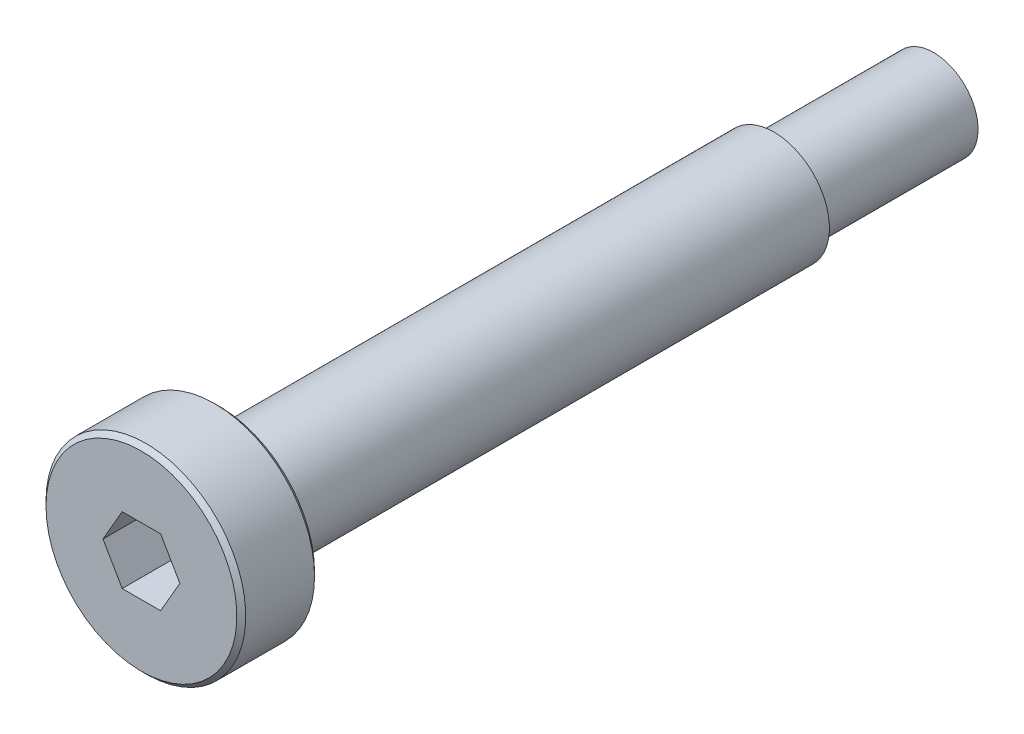
ISO-10303-21;
HEADER;
FILE_DESCRIPTION(('STEP AP214'),'2;1');
FILE_NAME('part.step','',(''),(''),'','','');
FILE_SCHEMA(('AUTOMOTIVE_DESIGN { 1 0 10303 214 1 1 1 1 }'));
ENDSEC;
DATA;
#1=APPLICATION_CONTEXT('core data for automotive mechanical design processes');
#2=APPLICATION_PROTOCOL_DEFINITION('international standard','automotive_design',2000,#1);
#3=PRODUCT_CONTEXT('',#1,'mechanical');
#4=PRODUCT('Part','Part','',(#3));
#5=PRODUCT_RELATED_PRODUCT_CATEGORY('part','',(#4));
#6=PRODUCT_DEFINITION_FORMATION('','',#4);
#7=PRODUCT_DEFINITION_CONTEXT('part definition',#1,'design');
#8=PRODUCT_DEFINITION('design','',#6,#7);
#9=PRODUCT_DEFINITION_SHAPE('','',#8);
#10=(LENGTH_UNIT() NAMED_UNIT(*) SI_UNIT(.MILLI.,.METRE.));
#11=(NAMED_UNIT(*) PLANE_ANGLE_UNIT() SI_UNIT($,.RADIAN.));
#12=(NAMED_UNIT(*) SI_UNIT($,.STERADIAN.) SOLID_ANGLE_UNIT());
#13=UNCERTAINTY_MEASURE_WITH_UNIT(LENGTH_MEASURE(1.E-05),#10,'distance_accuracy_value','');
#14=(GEOMETRIC_REPRESENTATION_CONTEXT(3) GLOBAL_UNCERTAINTY_ASSIGNED_CONTEXT((#13)) GLOBAL_UNIT_ASSIGNED_CONTEXT((#10,
#11,#12)) REPRESENTATION_CONTEXT('',''));
#15=CARTESIAN_POINT('',(0.,0.,0.));
#16=DIRECTION('',(0.,0.,1.));
#17=DIRECTION('',(1.,0.,0.));
#18=AXIS2_PLACEMENT_3D('',#15,#16,#17);
#19=CARTESIAN_POINT('',(0.,0.,0.));
#20=DIRECTION('',(0.,0.,-1.));
#21=DIRECTION('',(-1.,0.,0.));
#22=AXIS2_PLACEMENT_3D('',#19,#20,#21);
#23=PLANE('',#22);
#24=CARTESIAN_POINT('',(0.,0.,0.));
#25=DIRECTION('',(0.,0.,-1.));
#26=DIRECTION('',(-1.,0.,0.));
#27=AXIS2_PLACEMENT_3D('',#24,#25,#26);
#28=CIRCLE('',#27,4.29999999999999);
#29=CARTESIAN_POINT('',(-4.29999999999999,0.,0.));
#30=VERTEX_POINT('',#29);
#31=EDGE_CURVE('E11',#30,#30,#28,.F.);
#32=ORIENTED_EDGE('',*,*,#31,.T.);
#33=EDGE_LOOP('',(#32));
#34=FACE_BOUND('',#33,.T.);
#35=DIRECTION('',(-0.5,0.866025403784438,0.));
#36=VECTOR('',#35,1.);
#37=CARTESIAN_POINT('',(1.73205080756888,0.,0.));
#38=LINE('',#37,#36);
#39=CARTESIAN_POINT('',(1.73205080756888,0.,0.));
#40=VERTEX_POINT('',#39);
#41=CARTESIAN_POINT('',(0.866025403784438,1.5,0.));
#42=VERTEX_POINT('',#41);
#43=EDGE_CURVE('E135',#40,#42,#38,.T.);
#44=ORIENTED_EDGE('',*,*,#43,.F.);
#45=DIRECTION('',(0.5,0.866025403784439,0.));
#46=VECTOR('',#45,1.);
#47=CARTESIAN_POINT('',(0.86602540378444,-1.5,0.));
#48=LINE('',#47,#46);
#49=CARTESIAN_POINT('',(0.86602540378444,-1.5,0.));
#50=VERTEX_POINT('',#49);
#51=EDGE_CURVE('E61',#50,#40,#48,.T.);
#52=ORIENTED_EDGE('',*,*,#51,.F.);
#53=DIRECTION('',(1.,0.,0.));
#54=VECTOR('',#53,1.);
#55=CARTESIAN_POINT('',(-0.866025403784438,-1.5,0.));
#56=LINE('',#55,#54);
#57=CARTESIAN_POINT('',(-0.866025403784438,-1.5,0.));
#58=VERTEX_POINT('',#57);
#59=EDGE_CURVE('E144',#58,#50,#56,.T.);
#60=ORIENTED_EDGE('',*,*,#59,.F.);
#61=DIRECTION('',(0.5,-0.866025403784439,0.));
#62=VECTOR('',#61,1.);
#63=CARTESIAN_POINT('',(-1.73205080756888,0.,0.));
#64=LINE('',#63,#62);
#65=CARTESIAN_POINT('',(-1.73205080756888,0.,0.));
#66=VERTEX_POINT('',#65);
#67=EDGE_CURVE('E142',#66,#58,#64,.T.);
#68=ORIENTED_EDGE('',*,*,#67,.F.);
#69=DIRECTION('',(-0.5,-0.866025403784439,0.));
#70=VECTOR('',#69,1.);
#71=CARTESIAN_POINT('',(-0.866025403784439,1.5,0.));
#72=LINE('',#71,#70);
#73=CARTESIAN_POINT('',(-0.866025403784439,1.5,0.));
#74=VERTEX_POINT('',#73);
#75=EDGE_CURVE('E109',#74,#66,#72,.T.);
#76=ORIENTED_EDGE('',*,*,#75,.F.);
#77=DIRECTION('',(-1.,0.,0.));
#78=VECTOR('',#77,1.);
#79=CARTESIAN_POINT('',(0.866025403784438,1.5,0.));
#80=LINE('',#79,#78);
#81=EDGE_CURVE('E138',#42,#74,#80,.T.);
#82=ORIENTED_EDGE('',*,*,#81,.F.);
#83=EDGE_LOOP('',(#44,#52,#60,#68,#76,#82));
#84=FACE_BOUND('',#83,.T.);
#85=ADVANCED_FACE('F45',(#34,#84),#23,.F.);
#86=CARTESIAN_POINT('',(0.,0.,-35.7));
#87=DIRECTION('',(0.,0.,-1.));
#88=DIRECTION('',(-1.,0.,0.));
#89=AXIS2_PLACEMENT_3D('',#86,#87,#88);
#90=CYLINDRICAL_SURFACE('',#89,4.5);
#91=CARTESIAN_POINT('',(0.,0.,-3.3));
#92=DIRECTION('',(0.,0.,1.));
#93=DIRECTION('',(1.,0.,0.));
#94=AXIS2_PLACEMENT_3D('',#91,#92,#93);
#95=CIRCLE('',#94,4.5);
#96=CARTESIAN_POINT('',(4.5,0.,-3.3));
#97=VERTEX_POINT('',#96);
#98=EDGE_CURVE('E54',#97,#97,#95,.T.);
#99=ORIENTED_EDGE('',*,*,#98,.T.);
#100=EDGE_LOOP('',(#99));
#101=FACE_BOUND('',#100,.T.);
#102=CARTESIAN_POINT('',(0.,0.,-0.200000000000006));
#103=DIRECTION('',(0.,0.,-1.));
#104=DIRECTION('',(-1.,0.,0.));
#105=AXIS2_PLACEMENT_3D('',#102,#103,#104);
#106=CIRCLE('',#105,4.5);
#107=CARTESIAN_POINT('',(-4.5,0.,-0.200000000000006));
#108=VERTEX_POINT('',#107);
#109=EDGE_CURVE('E168',#108,#108,#106,.T.);
#110=ORIENTED_EDGE('',*,*,#109,.T.);
#111=EDGE_LOOP('',(#110));
#112=FACE_BOUND('',#111,.T.);
#113=ADVANCED_FACE('F173',(#101,#112),#90,.T.);
#114=CARTESIAN_POINT('',(0.,-4.5,-3.5));
#115=DIRECTION('',(0.,0.,1.));
#116=DIRECTION('',(1.,0.,0.));
#117=AXIS2_PLACEMENT_3D('',#114,#115,#116);
#118=PLANE('',#117);
#119=CARTESIAN_POINT('',(0.,0.,-3.5));
#120=DIRECTION('',(0.,0.,1.));
#121=DIRECTION('',(1.,0.,0.));
#122=AXIS2_PLACEMENT_3D('',#119,#120,#121);
#123=CIRCLE('',#122,4.3);
#124=CARTESIAN_POINT('',(4.3,0.,-3.5));
#125=VERTEX_POINT('',#124);
#126=EDGE_CURVE('E165',#125,#125,#123,.F.);
#127=ORIENTED_EDGE('',*,*,#126,.T.);
#128=EDGE_LOOP('',(#127));
#129=FACE_BOUND('',#128,.T.);
#130=CARTESIAN_POINT('',(0.,0.,-3.5));
#131=DIRECTION('',(0.,0.,-1.));
#132=DIRECTION('',(-1.,0.,0.));
#133=AXIS2_PLACEMENT_3D('',#130,#131,#132);
#134=CIRCLE('',#133,2.5);
#135=CARTESIAN_POINT('',(-2.5,0.,-3.5));
#136=VERTEX_POINT('',#135);
#137=EDGE_CURVE('E162',#136,#136,#134,.T.);
#138=ORIENTED_EDGE('',*,*,#137,.F.);
#139=EDGE_LOOP('',(#138));
#140=FACE_BOUND('',#139,.T.);
#141=ADVANCED_FACE('F181',(#129,#140),#118,.F.);
#142=CARTESIAN_POINT('',(0.,0.,-35.7));
#143=DIRECTION('',(0.,0.,-1.));
#144=DIRECTION('',(-1.,0.,0.));
#145=AXIS2_PLACEMENT_3D('',#142,#143,#144);
#146=CYLINDRICAL_SURFACE('',#145,2.5);
#147=CARTESIAN_POINT('',(0.,0.,-28.5));
#148=DIRECTION('',(0.,0.,-1.));
#149=DIRECTION('',(-1.,0.,0.));
#150=AXIS2_PLACEMENT_3D('',#147,#148,#149);
#151=CIRCLE('',#150,2.5);
#152=CARTESIAN_POINT('',(-2.5,0.,-28.5));
#153=VERTEX_POINT('',#152);
#154=EDGE_CURVE('E159',#153,#153,#151,.T.);
#155=ORIENTED_EDGE('',*,*,#154,.F.);
#156=EDGE_LOOP('',(#155));
#157=FACE_BOUND('',#156,.T.);
#158=ORIENTED_EDGE('',*,*,#137,.T.);
#159=EDGE_LOOP('',(#158));
#160=FACE_BOUND('',#159,.T.);
#161=ADVANCED_FACE('F184',(#157,#160),#146,.T.);
#162=CARTESIAN_POINT('',(0.,-2.5,-28.5));
#163=DIRECTION('',(0.,0.,1.));
#164=DIRECTION('',(1.,0.,0.));
#165=AXIS2_PLACEMENT_3D('',#162,#163,#164);
#166=PLANE('',#165);
#167=CARTESIAN_POINT('',(0.,0.,-28.5));
#168=DIRECTION('',(0.,0.,-1.));
#169=DIRECTION('',(-1.,0.,0.));
#170=AXIS2_PLACEMENT_3D('',#167,#168,#169);
#171=CIRCLE('',#170,2.);
#172=CARTESIAN_POINT('',(-2.,0.,-28.5));
#173=VERTEX_POINT('',#172);
#174=EDGE_CURVE('E156',#173,#173,#171,.T.);
#175=ORIENTED_EDGE('',*,*,#174,.F.);
#176=EDGE_LOOP('',(#175));
#177=FACE_BOUND('',#176,.T.);
#178=ORIENTED_EDGE('',*,*,#154,.T.);
#179=EDGE_LOOP('',(#178));
#180=FACE_BOUND('',#179,.T.);
#181=ADVANCED_FACE('F189',(#177,#180),#166,.F.);
#182=CARTESIAN_POINT('',(0.,0.,-35.7));
#183=DIRECTION('',(0.,0.,-1.));
#184=DIRECTION('',(-1.,0.,0.));
#185=AXIS2_PLACEMENT_3D('',#182,#183,#184);
#186=CYLINDRICAL_SURFACE('',#185,2.);
#187=CARTESIAN_POINT('',(0.,0.,-35.7));
#188=DIRECTION('',(0.,0.,-1.));
#189=DIRECTION('',(-1.,0.,0.));
#190=AXIS2_PLACEMENT_3D('',#187,#188,#189);
#191=CIRCLE('',#190,2.);
#192=CARTESIAN_POINT('',(-2.,0.,-35.7));
#193=VERTEX_POINT('',#192);
#194=EDGE_CURVE('E148',#193,#193,#191,.T.);
#195=ORIENTED_EDGE('',*,*,#194,.F.);
#196=EDGE_LOOP('',(#195));
#197=FACE_BOUND('',#196,.T.);
#198=ORIENTED_EDGE('',*,*,#174,.T.);
#199=EDGE_LOOP('',(#198));
#200=FACE_BOUND('',#199,.T.);
#201=ADVANCED_FACE('F195',(#197,#200),#186,.T.);
#202=CARTESIAN_POINT('',(0.,-2.,-35.7));
#203=DIRECTION('',(0.,0.,1.));
#204=DIRECTION('',(1.,0.,0.));
#205=AXIS2_PLACEMENT_3D('',#202,#203,#204);
#206=PLANE('',#205);
#207=ORIENTED_EDGE('',*,*,#194,.T.);
#208=EDGE_LOOP('',(#207));
#209=FACE_BOUND('',#208,.T.);
#210=ADVANCED_FACE('F223',(#209),#206,.F.);
#211=CARTESIAN_POINT('',(0.86602540378444,-1.5,-3.));
#212=DIRECTION('',(0.866025403784439,-0.5,0.));
#213=DIRECTION('',(0.5,0.866025403784439,0.));
#214=AXIS2_PLACEMENT_3D('',#211,#212,#213);
#215=PLANE('',#214);
#216=ORIENTED_EDGE('',*,*,#51,.T.);
#217=DIRECTION('',(0.,0.,1.));
#218=VECTOR('',#217,1.);
#219=CARTESIAN_POINT('',(1.73205080756888,0.,-3.));
#220=LINE('',#219,#218);
#221=CARTESIAN_POINT('',(1.73205080756888,0.,-3.));
#222=VERTEX_POINT('',#221);
#223=EDGE_CURVE('E91',#222,#40,#220,.T.);
#224=ORIENTED_EDGE('',*,*,#223,.F.);
#225=DIRECTION('',(0.5,0.866025403784439,0.));
#226=VECTOR('',#225,1.);
#227=CARTESIAN_POINT('',(0.86602540378444,-1.5,-3.));
#228=LINE('',#227,#226);
#229=CARTESIAN_POINT('',(0.86602540378444,-1.5,-3.));
#230=VERTEX_POINT('',#229);
#231=EDGE_CURVE('E146',#230,#222,#228,.T.);
#232=ORIENTED_EDGE('',*,*,#231,.F.);
#233=DIRECTION('',(0.,0.,1.));
#234=VECTOR('',#233,1.);
#235=CARTESIAN_POINT('',(0.86602540378444,-1.5,-3.));
#236=LINE('',#235,#234);
#237=EDGE_CURVE('E69',#230,#50,#236,.T.);
#238=ORIENTED_EDGE('',*,*,#237,.T.);
#239=EDGE_LOOP('',(#216,#224,#232,#238));
#240=FACE_BOUND('',#239,.T.);
#241=ADVANCED_FACE('F220',(#240),#215,.F.);
#242=CARTESIAN_POINT('',(-0.866025403784438,-1.5,-3.));
#243=DIRECTION('',(0.,-1.,0.));
#244=DIRECTION('',(0.,0.,-1.));
#245=AXIS2_PLACEMENT_3D('',#242,#243,#244);
#246=PLANE('',#245);
#247=ORIENTED_EDGE('',*,*,#59,.T.);
#248=ORIENTED_EDGE('',*,*,#237,.F.);
#249=DIRECTION('',(1.,0.,0.));
#250=VECTOR('',#249,1.);
#251=CARTESIAN_POINT('',(-0.866025403784438,-1.5,-3.));
#252=LINE('',#251,#250);
#253=CARTESIAN_POINT('',(-0.866025403784438,-1.5,-3.));
#254=VERTEX_POINT('',#253);
#255=EDGE_CURVE('E121',#254,#230,#252,.T.);
#256=ORIENTED_EDGE('',*,*,#255,.F.);
#257=DIRECTION('',(0.,0.,1.));
#258=VECTOR('',#257,1.);
#259=CARTESIAN_POINT('',(-0.866025403784438,-1.5,-3.));
#260=LINE('',#259,#258);
#261=EDGE_CURVE('E113',#254,#58,#260,.T.);
#262=ORIENTED_EDGE('',*,*,#261,.T.);
#263=EDGE_LOOP('',(#247,#248,#256,#262));
#264=FACE_BOUND('',#263,.T.);
#265=ADVANCED_FACE('F222',(#264),#246,.F.);
#266=CARTESIAN_POINT('',(-1.73205080756888,0.,-3.));
#267=DIRECTION('',(-0.866025403784439,-0.5,0.));
#268=DIRECTION('',(0.5,-0.866025403784439,0.));
#269=AXIS2_PLACEMENT_3D('',#266,#267,#268);
#270=PLANE('',#269);
#271=ORIENTED_EDGE('',*,*,#67,.T.);
#272=ORIENTED_EDGE('',*,*,#261,.F.);
#273=DIRECTION('',(0.5,-0.866025403784439,0.));
#274=VECTOR('',#273,1.);
#275=CARTESIAN_POINT('',(-1.73205080756888,0.,-3.));
#276=LINE('',#275,#274);
#277=CARTESIAN_POINT('',(-1.73205080756888,0.,-3.));
#278=VERTEX_POINT('',#277);
#279=EDGE_CURVE('E117',#278,#254,#276,.T.);
#280=ORIENTED_EDGE('',*,*,#279,.F.);
#281=DIRECTION('',(0.,0.,1.));
#282=VECTOR('',#281,1.);
#283=CARTESIAN_POINT('',(-1.73205080756888,0.,-3.));
#284=LINE('',#283,#282);
#285=EDGE_CURVE('E102',#278,#66,#284,.T.);
#286=ORIENTED_EDGE('',*,*,#285,.T.);
#287=EDGE_LOOP('',(#271,#272,#280,#286));
#288=FACE_BOUND('',#287,.T.);
#289=ADVANCED_FACE('F118',(#288),#270,.F.);
#290=CARTESIAN_POINT('',(-0.866025403784439,1.5,-3.));
#291=DIRECTION('',(-0.866025403784439,0.5,0.));
#292=DIRECTION('',(-0.5,-0.866025403784439,0.));
#293=AXIS2_PLACEMENT_3D('',#290,#291,#292);
#294=PLANE('',#293);
#295=ORIENTED_EDGE('',*,*,#75,.T.);
#296=ORIENTED_EDGE('',*,*,#285,.F.);
#297=DIRECTION('',(-0.5,-0.866025403784439,0.));
#298=VECTOR('',#297,1.);
#299=CARTESIAN_POINT('',(-0.866025403784439,1.5,-3.));
#300=LINE('',#299,#298);
#301=CARTESIAN_POINT('',(-0.866025403784439,1.5,-3.));
#302=VERTEX_POINT('',#301);
#303=EDGE_CURVE('E106',#302,#278,#300,.T.);
#304=ORIENTED_EDGE('',*,*,#303,.F.);
#305=DIRECTION('',(0.,0.,1.));
#306=VECTOR('',#305,1.);
#307=CARTESIAN_POINT('',(-0.866025403784439,1.5,-3.));
#308=LINE('',#307,#306);
#309=EDGE_CURVE('E114',#302,#74,#308,.T.);
#310=ORIENTED_EDGE('',*,*,#309,.T.);
#311=EDGE_LOOP('',(#295,#296,#304,#310));
#312=FACE_BOUND('',#311,.T.);
#313=ADVANCED_FACE('F104',(#312),#294,.F.);
#314=CARTESIAN_POINT('',(0.866025403784438,1.5,-3.));
#315=DIRECTION('',(0.,1.,0.));
#316=DIRECTION('',(-1.,0.,0.));
#317=AXIS2_PLACEMENT_3D('',#314,#315,#316);
#318=PLANE('',#317);
#319=ORIENTED_EDGE('',*,*,#81,.T.);
#320=ORIENTED_EDGE('',*,*,#309,.F.);
#321=DIRECTION('',(-1.,0.,0.));
#322=VECTOR('',#321,1.);
#323=CARTESIAN_POINT('',(0.866025403784438,1.5,-3.));
#324=LINE('',#323,#322);
#325=CARTESIAN_POINT('',(0.866025403784438,1.5,-3.));
#326=VERTEX_POINT('',#325);
#327=EDGE_CURVE('E127',#326,#302,#324,.T.);
#328=ORIENTED_EDGE('',*,*,#327,.F.);
#329=DIRECTION('',(0.,0.,1.));
#330=VECTOR('',#329,1.);
#331=CARTESIAN_POINT('',(0.866025403784438,1.5,-3.));
#332=LINE('',#331,#330);
#333=EDGE_CURVE('E151',#326,#42,#332,.T.);
#334=ORIENTED_EDGE('',*,*,#333,.T.);
#335=EDGE_LOOP('',(#319,#320,#328,#334));
#336=FACE_BOUND('',#335,.T.);
#337=ADVANCED_FACE('F280',(#336),#318,.F.);
#338=CARTESIAN_POINT('',(1.73205080756888,0.,-3.));
#339=DIRECTION('',(0.866025403784438,0.5,0.));
#340=DIRECTION('',(-0.5,0.866025403784439,0.));
#341=AXIS2_PLACEMENT_3D('',#338,#339,#340);
#342=PLANE('',#341);
#343=ORIENTED_EDGE('',*,*,#43,.T.);
#344=ORIENTED_EDGE('',*,*,#333,.F.);
#345=DIRECTION('',(-0.5,0.866025403784438,0.));
#346=VECTOR('',#345,1.);
#347=CARTESIAN_POINT('',(1.73205080756888,0.,-3.));
#348=LINE('',#347,#346);
#349=EDGE_CURVE('E129',#222,#326,#348,.T.);
#350=ORIENTED_EDGE('',*,*,#349,.F.);
#351=ORIENTED_EDGE('',*,*,#223,.T.);
#352=EDGE_LOOP('',(#343,#344,#350,#351));
#353=FACE_BOUND('',#352,.T.);
#354=ADVANCED_FACE('F218',(#353),#342,.F.);
#355=CARTESIAN_POINT('',(0.,0.,-3.));
#356=DIRECTION('',(0.,0.,1.));
#357=DIRECTION('',(1.,0.,0.));
#358=AXIS2_PLACEMENT_3D('',#355,#356,#357);
#359=PLANE('',#358);
#360=ORIENTED_EDGE('',*,*,#231,.T.);
#361=ORIENTED_EDGE('',*,*,#349,.T.);
#362=ORIENTED_EDGE('',*,*,#327,.T.);
#363=ORIENTED_EDGE('',*,*,#303,.T.);
#364=ORIENTED_EDGE('',*,*,#279,.T.);
#365=ORIENTED_EDGE('',*,*,#255,.T.);
#366=EDGE_LOOP('',(#360,#361,#362,#363,#364,#365));
#367=FACE_BOUND('',#366,.T.);
#368=ADVANCED_FACE('F124',(#367),#359,.T.);
#369=CARTESIAN_POINT('',(0.,0.,-3.5));
#370=DIRECTION('',(0.,0.,1.));
#371=DIRECTION('',(1.,0.,0.));
#372=AXIS2_PLACEMENT_3D('',#369,#370,#371);
#373=CONICAL_SURFACE('',#372,4.3,0.785398163397429);
#374=ORIENTED_EDGE('',*,*,#98,.F.);
#375=EDGE_LOOP('',(#374));
#376=FACE_BOUND('',#375,.T.);
#377=ORIENTED_EDGE('',*,*,#126,.F.);
#378=EDGE_LOOP('',(#377));
#379=FACE_BOUND('',#378,.T.);
#380=ADVANCED_FACE('F176',(#376,#379),#373,.T.);
#381=CARTESIAN_POINT('',(0.,0.,-0.200000000000006));
#382=DIRECTION('',(0.,0.,-1.));
#383=DIRECTION('',(-1.,0.,0.));
#384=AXIS2_PLACEMENT_3D('',#381,#382,#383);
#385=CONICAL_SURFACE('',#384,4.5,0.785398163397446);
#386=ORIENTED_EDGE('',*,*,#31,.F.);
#387=EDGE_LOOP('',(#386));
#388=FACE_BOUND('',#387,.T.);
#389=ORIENTED_EDGE('',*,*,#109,.F.);
#390=EDGE_LOOP('',(#389));
#391=FACE_BOUND('',#390,.T.);
#392=ADVANCED_FACE('F48',(#388,#391),#385,.T.);
#393=CLOSED_SHELL('',(#85,#113,#141,#161,#181,#201,#210,#241,#265,#289,#313,#337,#354,#368,#380,#392));
#394=MANIFOLD_SOLID_BREP('B2',#393);
#395=ADVANCED_BREP_SHAPE_REPRESENTATION('',(#18,#394),#14);
#396=SHAPE_DEFINITION_REPRESENTATION(#9,#395);
ENDSEC;
END-ISO-10303-21;
